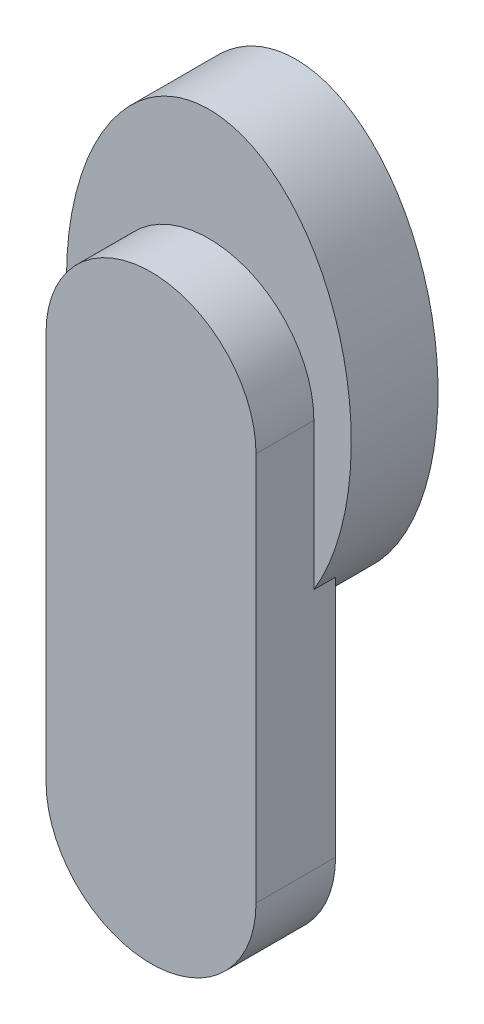
ISO-10303-21;
HEADER;
FILE_DESCRIPTION(('STEP AP214'),'2;1');
FILE_NAME('part.step','',(''),(''),'','','');
FILE_SCHEMA(('AUTOMOTIVE_DESIGN { 1 0 10303 214 1 1 1 1 }'));
ENDSEC;
DATA;
#1=APPLICATION_CONTEXT('core data for automotive mechanical design processes');
#2=APPLICATION_PROTOCOL_DEFINITION('international standard','automotive_design',2000,#1);
#3=PRODUCT_CONTEXT('',#1,'mechanical');
#4=PRODUCT('Part','Part','',(#3));
#5=PRODUCT_RELATED_PRODUCT_CATEGORY('part','',(#4));
#6=PRODUCT_DEFINITION_FORMATION('','',#4);
#7=PRODUCT_DEFINITION_CONTEXT('part definition',#1,'design');
#8=PRODUCT_DEFINITION('design','',#6,#7);
#9=PRODUCT_DEFINITION_SHAPE('','',#8);
#10=(LENGTH_UNIT() NAMED_UNIT(*) SI_UNIT(.MILLI.,.METRE.));
#11=(NAMED_UNIT(*) PLANE_ANGLE_UNIT() SI_UNIT($,.RADIAN.));
#12=(NAMED_UNIT(*) SI_UNIT($,.STERADIAN.) SOLID_ANGLE_UNIT());
#13=UNCERTAINTY_MEASURE_WITH_UNIT(LENGTH_MEASURE(1.E-05),#10,'distance_accuracy_value','');
#14=(GEOMETRIC_REPRESENTATION_CONTEXT(3) GLOBAL_UNCERTAINTY_ASSIGNED_CONTEXT((#13)) GLOBAL_UNIT_ASSIGNED_CONTEXT((#10,
#11,#12)) REPRESENTATION_CONTEXT('',''));
#15=CARTESIAN_POINT('',(0.,0.,0.));
#16=DIRECTION('',(0.,0.,1.));
#17=DIRECTION('',(1.,0.,0.));
#18=AXIS2_PLACEMENT_3D('',#15,#16,#17);
#19=CARTESIAN_POINT('',(0.,0.,-2.));
#20=DIRECTION('',(0.,0.,1.));
#21=DIRECTION('',(0.,-1.,0.));
#22=AXIS2_PLACEMENT_3D('',#19,#20,#21);
#23=ELLIPSE('',#22,30.,19.6915116127355);
#24=DIRECTION('',(0.,0.,1.));
#25=VECTOR('',#24,1.);
#26=SURFACE_OF_LINEAR_EXTRUSION('',#23,#25);
#27=DIRECTION('',(0.,0.,1.));
#28=VECTOR('',#27,1.);
#29=CARTESIAN_POINT('',(14.5182246714099,-20.267507658462,-2.));
#30=LINE('',#29,#28);
#31=CARTESIAN_POINT('',(14.5182246714099,-20.267507658462,7.));
#32=VERTEX_POINT('',#31);
#33=CARTESIAN_POINT('',(14.5182246714099,-20.267507658462,10.));
#34=VERTEX_POINT('',#33);
#35=EDGE_CURVE('E59',#32,#34,#30,.T.);
#36=ORIENTED_EDGE('',*,*,#35,.F.);
#37=CARTESIAN_POINT('',(0.,0.,7.));
#38=DIRECTION('',(0.,0.,1.));
#39=DIRECTION('',(0.,-1.,0.));
#40=AXIS2_PLACEMENT_3D('',#37,#38,#39);
#41=ELLIPSE('',#40,30.,19.6915116127355);
#42=CARTESIAN_POINT('',(-14.5182246714099,-20.267507658462,7.));
#43=VERTEX_POINT('',#42);
#44=EDGE_CURVE('E11',#32,#43,#41,.F.);
#45=ORIENTED_EDGE('',*,*,#44,.T.);
#46=DIRECTION('',(0.,0.,1.));
#47=VECTOR('',#46,1.);
#48=CARTESIAN_POINT('',(-14.5182246714099,-20.267507658462,-2.));
#49=LINE('',#48,#47);
#50=CARTESIAN_POINT('',(-14.5182246714099,-20.267507658462,10.));
#51=VERTEX_POINT('',#50);
#52=EDGE_CURVE('E131',#51,#43,#49,.F.);
#53=ORIENTED_EDGE('',*,*,#52,.F.);
#54=CARTESIAN_POINT('',(0.,0.,10.));
#55=DIRECTION('',(0.,0.,1.));
#56=DIRECTION('',(0.,-1.,0.));
#57=AXIS2_PLACEMENT_3D('',#54,#55,#56);
#58=ELLIPSE('',#57,30.,19.6915116127355);
#59=EDGE_CURVE('E137',#34,#51,#58,.T.);
#60=ORIENTED_EDGE('',*,*,#59,.F.);
#61=EDGE_LOOP('',(#36,#45,#53,#60));
#62=FACE_BOUND('',#61,.T.);
#63=CARTESIAN_POINT('',(0.,-30.,-2.));
#64=VERTEX_POINT('',#63);
#65=EDGE_CURVE('E138',#64,#64,#23,.T.);
#66=ORIENTED_EDGE('',*,*,#65,.T.);
#67=EDGE_LOOP('',(#66));
#68=FACE_BOUND('',#67,.T.);
#69=ADVANCED_FACE('F41',(#62,#68),#26,.T.);
#70=CARTESIAN_POINT('',(0.,0.,-2.));
#71=DIRECTION('',(0.,0.,1.));
#72=DIRECTION('',(1.,0.,0.));
#73=AXIS2_PLACEMENT_3D('',#70,#71,#72);
#74=PLANE('',#73);
#75=ORIENTED_EDGE('',*,*,#65,.F.);
#76=EDGE_LOOP('',(#75));
#77=FACE_BOUND('',#76,.T.);
#78=ADVANCED_FACE('F166',(#77),#74,.F.);
#79=CARTESIAN_POINT('',(0.,0.,10.));
#80=DIRECTION('',(0.,0.,1.));
#81=DIRECTION('',(1.,0.,0.));
#82=AXIS2_PLACEMENT_3D('',#79,#80,#81);
#83=PLANE('',#82);
#84=DIRECTION('',(0.,1.,0.));
#85=VECTOR('',#84,1.);
#86=CARTESIAN_POINT('',(14.5182246714099,0.,10.));
#87=LINE('',#86,#85);
#88=CARTESIAN_POINT('',(14.5182246714099,0.,10.));
#89=VERTEX_POINT('',#88);
#90=EDGE_CURVE('E49',#34,#89,#87,.T.);
#91=ORIENTED_EDGE('',*,*,#90,.F.);
#92=ORIENTED_EDGE('',*,*,#59,.T.);
#93=DIRECTION('',(0.,-1.,0.));
#94=VECTOR('',#93,1.);
#95=CARTESIAN_POINT('',(-14.5182246714099,0.,10.));
#96=LINE('',#95,#94);
#97=CARTESIAN_POINT('',(-14.5182246714099,0.,10.));
#98=VERTEX_POINT('',#97);
#99=EDGE_CURVE('E142',#98,#51,#96,.T.);
#100=ORIENTED_EDGE('',*,*,#99,.F.);
#101=CARTESIAN_POINT('',(0.,0.,10.));
#102=DIRECTION('',(0.,0.,1.));
#103=DIRECTION('',(1.,0.,0.));
#104=AXIS2_PLACEMENT_3D('',#101,#102,#103);
#105=CIRCLE('',#104,14.5182246714099);
#106=EDGE_CURVE('E99',#89,#98,#105,.T.);
#107=ORIENTED_EDGE('',*,*,#106,.F.);
#108=EDGE_LOOP('',(#91,#92,#100,#107));
#109=FACE_BOUND('',#108,.T.);
#110=ADVANCED_FACE('F148',(#109),#83,.T.);
#111=CARTESIAN_POINT('',(0.,0.,7.));
#112=DIRECTION('',(0.,0.,1.));
#113=DIRECTION('',(1.,0.,0.));
#114=AXIS2_PLACEMENT_3D('',#111,#112,#113);
#115=CYLINDRICAL_SURFACE('',#114,14.5182246714099);
#116=DIRECTION('',(0.,0.,1.));
#117=VECTOR('',#116,1.);
#118=CARTESIAN_POINT('',(14.5182246714099,0.,7.));
#119=LINE('',#118,#117);
#120=CARTESIAN_POINT('',(14.5182246714099,0.,18.));
#121=VERTEX_POINT('',#120);
#122=EDGE_CURVE('E129',#89,#121,#119,.T.);
#123=ORIENTED_EDGE('',*,*,#122,.F.);
#124=ORIENTED_EDGE('',*,*,#106,.T.);
#125=DIRECTION('',(0.,0.,1.));
#126=VECTOR('',#125,1.);
#127=CARTESIAN_POINT('',(-14.5182246714099,0.,7.));
#128=LINE('',#127,#126);
#129=CARTESIAN_POINT('',(-14.5182246714099,0.,18.));
#130=VERTEX_POINT('',#129);
#131=EDGE_CURVE('E93',#98,#130,#128,.T.);
#132=ORIENTED_EDGE('',*,*,#131,.T.);
#133=CARTESIAN_POINT('',(0.,0.,18.));
#134=DIRECTION('',(0.,0.,1.));
#135=DIRECTION('',(1.,0.,0.));
#136=AXIS2_PLACEMENT_3D('',#133,#134,#135);
#137=CIRCLE('',#136,14.5182246714099);
#138=EDGE_CURVE('E98',#121,#130,#137,.T.);
#139=ORIENTED_EDGE('',*,*,#138,.F.);
#140=EDGE_LOOP('',(#123,#124,#132,#139));
#141=FACE_BOUND('',#140,.T.);
#142=ADVANCED_FACE('F96',(#141),#115,.T.);
#143=CARTESIAN_POINT('',(14.5182246714099,0.,7.));
#144=DIRECTION('',(1.,0.,0.));
#145=DIRECTION('',(0.,1.,0.));
#146=AXIS2_PLACEMENT_3D('',#143,#144,#145);
#147=PLANE('',#146);
#148=DIRECTION('',(0.,1.,0.));
#149=VECTOR('',#148,1.);
#150=CARTESIAN_POINT('',(14.5182246714099,0.,7.));
#151=LINE('',#150,#149);
#152=CARTESIAN_POINT('',(14.5182246714099,-53.8119782726979,7.));
#153=VERTEX_POINT('',#152);
#154=EDGE_CURVE('E103',#153,#32,#151,.T.);
#155=ORIENTED_EDGE('',*,*,#154,.T.);
#156=ORIENTED_EDGE('',*,*,#35,.T.);
#157=ORIENTED_EDGE('',*,*,#90,.T.);
#158=ORIENTED_EDGE('',*,*,#122,.T.);
#159=DIRECTION('',(0.,1.,0.));
#160=VECTOR('',#159,1.);
#161=CARTESIAN_POINT('',(14.5182246714099,0.,18.));
#162=LINE('',#161,#160);
#163=CARTESIAN_POINT('',(14.5182246714099,-53.8119782726979,18.));
#164=VERTEX_POINT('',#163);
#165=EDGE_CURVE('E117',#164,#121,#162,.T.);
#166=ORIENTED_EDGE('',*,*,#165,.F.);
#167=DIRECTION('',(0.,0.,1.));
#168=VECTOR('',#167,1.);
#169=CARTESIAN_POINT('',(14.5182246714099,-53.8119782726979,7.));
#170=LINE('',#169,#168);
#171=EDGE_CURVE('E132',#153,#164,#170,.T.);
#172=ORIENTED_EDGE('',*,*,#171,.F.);
#173=EDGE_LOOP('',(#155,#156,#157,#158,#166,#172));
#174=FACE_BOUND('',#173,.T.);
#175=ADVANCED_FACE('F146',(#174),#147,.T.);
#176=CARTESIAN_POINT('',(0.,-53.8119782726979,7.));
#177=DIRECTION('',(0.,0.,1.));
#178=DIRECTION('',(1.,0.,0.));
#179=AXIS2_PLACEMENT_3D('',#176,#177,#178);
#180=CYLINDRICAL_SURFACE('',#179,14.5182246714099);
#181=ORIENTED_EDGE('',*,*,#171,.T.);
#182=CARTESIAN_POINT('',(0.,-53.8119782726979,18.));
#183=DIRECTION('',(0.,0.,1.));
#184=DIRECTION('',(1.,0.,0.));
#185=AXIS2_PLACEMENT_3D('',#182,#183,#184);
#186=CIRCLE('',#185,14.5182246714099);
#187=CARTESIAN_POINT('',(-14.5182246714099,-53.8119782726979,18.));
#188=VERTEX_POINT('',#187);
#189=EDGE_CURVE('E112',#188,#164,#186,.T.);
#190=ORIENTED_EDGE('',*,*,#189,.F.);
#191=DIRECTION('',(0.,0.,1.));
#192=VECTOR('',#191,1.);
#193=CARTESIAN_POINT('',(-14.5182246714099,-53.8119782726979,7.));
#194=LINE('',#193,#192);
#195=CARTESIAN_POINT('',(-14.5182246714099,-53.8119782726979,7.));
#196=VERTEX_POINT('',#195);
#197=EDGE_CURVE('E102',#196,#188,#194,.T.);
#198=ORIENTED_EDGE('',*,*,#197,.F.);
#199=CARTESIAN_POINT('',(0.,-53.8119782726979,7.));
#200=DIRECTION('',(0.,0.,1.));
#201=DIRECTION('',(1.,0.,0.));
#202=AXIS2_PLACEMENT_3D('',#199,#200,#201);
#203=CIRCLE('',#202,14.5182246714099);
#204=EDGE_CURVE('E124',#196,#153,#203,.T.);
#205=ORIENTED_EDGE('',*,*,#204,.T.);
#206=EDGE_LOOP('',(#181,#190,#198,#205));
#207=FACE_BOUND('',#206,.T.);
#208=ADVANCED_FACE('F156',(#207),#180,.T.);
#209=CARTESIAN_POINT('',(-14.5182246714099,0.,7.));
#210=DIRECTION('',(-1.,0.,0.));
#211=DIRECTION('',(0.,-1.,0.));
#212=AXIS2_PLACEMENT_3D('',#209,#210,#211);
#213=PLANE('',#212);
#214=ORIENTED_EDGE('',*,*,#99,.T.);
#215=ORIENTED_EDGE('',*,*,#52,.T.);
#216=DIRECTION('',(0.,-1.,0.));
#217=VECTOR('',#216,1.);
#218=CARTESIAN_POINT('',(-14.5182246714099,0.,7.));
#219=LINE('',#218,#217);
#220=EDGE_CURVE('E122',#43,#196,#219,.T.);
#221=ORIENTED_EDGE('',*,*,#220,.T.);
#222=ORIENTED_EDGE('',*,*,#197,.T.);
#223=DIRECTION('',(0.,-1.,0.));
#224=VECTOR('',#223,1.);
#225=CARTESIAN_POINT('',(-14.5182246714099,0.,18.));
#226=LINE('',#225,#224);
#227=EDGE_CURVE('E106',#130,#188,#226,.T.);
#228=ORIENTED_EDGE('',*,*,#227,.F.);
#229=ORIENTED_EDGE('',*,*,#131,.F.);
#230=EDGE_LOOP('',(#214,#215,#221,#222,#228,#229));
#231=FACE_BOUND('',#230,.T.);
#232=ADVANCED_FACE('F107',(#231),#213,.T.);
#233=CARTESIAN_POINT('',(0.,0.,7.));
#234=DIRECTION('',(0.,0.,1.));
#235=DIRECTION('',(1.,0.,0.));
#236=AXIS2_PLACEMENT_3D('',#233,#234,#235);
#237=PLANE('',#236);
#238=ORIENTED_EDGE('',*,*,#44,.F.);
#239=ORIENTED_EDGE('',*,*,#154,.F.);
#240=ORIENTED_EDGE('',*,*,#204,.F.);
#241=ORIENTED_EDGE('',*,*,#220,.F.);
#242=EDGE_LOOP('',(#238,#239,#240,#241));
#243=FACE_BOUND('',#242,.T.);
#244=ADVANCED_FACE('F153',(#243),#237,.F.);
#245=CARTESIAN_POINT('',(0.,0.,18.));
#246=DIRECTION('',(0.,0.,1.));
#247=DIRECTION('',(1.,0.,0.));
#248=AXIS2_PLACEMENT_3D('',#245,#246,#247);
#249=PLANE('',#248);
#250=ORIENTED_EDGE('',*,*,#138,.T.);
#251=ORIENTED_EDGE('',*,*,#227,.T.);
#252=ORIENTED_EDGE('',*,*,#189,.T.);
#253=ORIENTED_EDGE('',*,*,#165,.T.);
#254=EDGE_LOOP('',(#250,#251,#252,#253));
#255=FACE_BOUND('',#254,.T.);
#256=ADVANCED_FACE('F115',(#255),#249,.T.);
#257=CLOSED_SHELL('',(#69,#78,#110,#142,#175,#208,#232,#244,#256));
#258=MANIFOLD_SOLID_BREP('B2',#257);
#259=ADVANCED_BREP_SHAPE_REPRESENTATION('',(#18,#258),#14);
#260=SHAPE_DEFINITION_REPRESENTATION(#9,#259);
ENDSEC;
END-ISO-10303-21;
